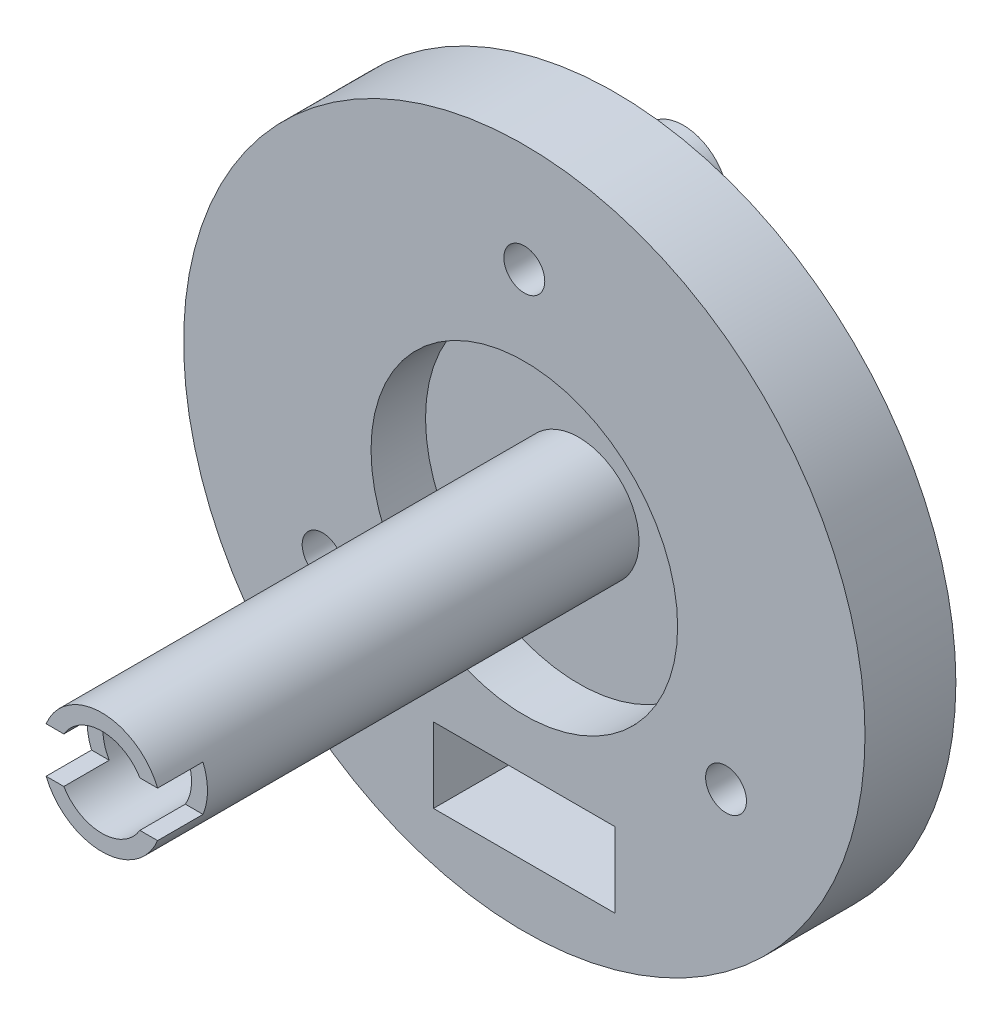
ISO-10303-21;
HEADER;
FILE_DESCRIPTION(('STEP AP214'),'2;1');
FILE_NAME('part.step','',(''),(''),'','','');
FILE_SCHEMA(('AUTOMOTIVE_DESIGN { 1 0 10303 214 1 1 1 1 }'));
ENDSEC;
DATA;
#1=APPLICATION_CONTEXT('core data for automotive mechanical design processes');
#2=APPLICATION_PROTOCOL_DEFINITION('international standard','automotive_design',2000,#1);
#3=PRODUCT_CONTEXT('',#1,'mechanical');
#4=PRODUCT('Part','Part','',(#3));
#5=PRODUCT_RELATED_PRODUCT_CATEGORY('part','',(#4));
#6=PRODUCT_DEFINITION_FORMATION('','',#4);
#7=PRODUCT_DEFINITION_CONTEXT('part definition',#1,'design');
#8=PRODUCT_DEFINITION('design','',#6,#7);
#9=PRODUCT_DEFINITION_SHAPE('','',#8);
#10=(LENGTH_UNIT() NAMED_UNIT(*) SI_UNIT(.MILLI.,.METRE.));
#11=(NAMED_UNIT(*) PLANE_ANGLE_UNIT() SI_UNIT($,.RADIAN.));
#12=(NAMED_UNIT(*) SI_UNIT($,.STERADIAN.) SOLID_ANGLE_UNIT());
#13=UNCERTAINTY_MEASURE_WITH_UNIT(LENGTH_MEASURE(1.E-05),#10,'distance_accuracy_value','');
#14=(GEOMETRIC_REPRESENTATION_CONTEXT(3) GLOBAL_UNCERTAINTY_ASSIGNED_CONTEXT((#13)) GLOBAL_UNIT_ASSIGNED_CONTEXT((#10,
#11,#12)) REPRESENTATION_CONTEXT('',''));
#15=CARTESIAN_POINT('',(0.,0.,0.));
#16=DIRECTION('',(0.,0.,1.));
#17=DIRECTION('',(1.,0.,0.));
#18=AXIS2_PLACEMENT_3D('',#15,#16,#17);
#19=CARTESIAN_POINT('',(175.5,-111.,25.6));
#20=DIRECTION('',(0.,0.,1.));
#21=DIRECTION('',(1.,0.,0.));
#22=AXIS2_PLACEMENT_3D('',#19,#20,#21);
#23=PLANE('',#22);
#24=DIRECTION('',(1.,0.,0.));
#25=VECTOR('',#24,1.);
#26=CARTESIAN_POINT('',(172.,-112.,25.6));
#27=LINE('',#26,#25);
#28=CARTESIAN_POINT('',(173.045921761638,-112.,25.6));
#29=VERTEX_POINT('',#28);
#30=CARTESIAN_POINT('',(173.825933095722,-112.,25.6));
#31=VERTEX_POINT('',#30);
#32=EDGE_CURVE('E314',#29,#31,#27,.T.);
#33=ORIENTED_EDGE('',*,*,#32,.F.);
#34=CARTESIAN_POINT('',(175.5,-111.,25.6));
#35=DIRECTION('',(0.,0.,1.));
#36=DIRECTION('',(1.,0.,0.));
#37=AXIS2_PLACEMENT_3D('',#34,#35,#36);
#38=CIRCLE('',#37,2.65000000000001);
#39=CARTESIAN_POINT('',(177.954078238362,-112.,25.6));
#40=VERTEX_POINT('',#39);
#41=EDGE_CURVE('E177',#29,#40,#38,.T.);
#42=ORIENTED_EDGE('',*,*,#41,.T.);
#43=CARTESIAN_POINT('',(177.174066904278,-112.,25.6));
#44=VERTEX_POINT('',#43);
#45=EDGE_CURVE('E168',#44,#40,#27,.T.);
#46=ORIENTED_EDGE('',*,*,#45,.F.);
#47=CARTESIAN_POINT('',(175.5,-111.,25.6));
#48=DIRECTION('',(0.,0.,1.));
#49=DIRECTION('',(1.,0.,0.));
#50=AXIS2_PLACEMENT_3D('',#47,#48,#49);
#51=CIRCLE('',#50,1.95);
#52=EDGE_CURVE('E295',#31,#44,#51,.T.);
#53=ORIENTED_EDGE('',*,*,#52,.F.);
#54=EDGE_LOOP('',(#33,#42,#46,#53));
#55=FACE_BOUND('',#54,.T.);
#56=ADVANCED_FACE('F34',(#55),#23,.T.);
#57=CARTESIAN_POINT('',(175.5,-111.,4.6));
#58=DIRECTION('',(0.,0.,1.));
#59=DIRECTION('',(1.,0.,0.));
#60=AXIS2_PLACEMENT_3D('',#57,#58,#59);
#61=PLANE('',#60);
#62=CARTESIAN_POINT('',(175.5,-111.,4.6));
#63=DIRECTION('',(0.,0.,1.));
#64=DIRECTION('',(1.,0.,0.));
#65=AXIS2_PLACEMENT_3D('',#62,#63,#64);
#66=CIRCLE('',#65,6.75);
#67=CARTESIAN_POINT('',(182.25,-111.,4.6));
#68=VERTEX_POINT('',#67);
#69=EDGE_CURVE('E208',#68,#68,#66,.T.);
#70=ORIENTED_EDGE('',*,*,#69,.T.);
#71=EDGE_LOOP('',(#70));
#72=FACE_BOUND('',#71,.T.);
#73=CARTESIAN_POINT('',(175.5,-111.,4.6));
#74=DIRECTION('',(0.,0.,1.));
#75=DIRECTION('',(1.,0.,0.));
#76=AXIS2_PLACEMENT_3D('',#73,#74,#75);
#77=CIRCLE('',#76,2.65000000000001);
#78=CARTESIAN_POINT('',(178.15,-111.,4.6));
#79=VERTEX_POINT('',#78);
#80=EDGE_CURVE('E182',#79,#79,#77,.T.);
#81=ORIENTED_EDGE('',*,*,#80,.F.);
#82=EDGE_LOOP('',(#81));
#83=FACE_BOUND('',#82,.T.);
#84=ADVANCED_FACE('F346',(#72,#83),#61,.T.);
#85=CARTESIAN_POINT('',(175.5,-111.,7.));
#86=DIRECTION('',(0.,0.,-1.));
#87=DIRECTION('',(-1.,0.,0.));
#88=AXIS2_PLACEMENT_3D('',#85,#86,#87);
#89=CYLINDRICAL_SURFACE('',#88,1.95);
#90=DIRECTION('',(0.,0.,-1.));
#91=VECTOR('',#90,1.);
#92=CARTESIAN_POINT('',(173.825933095722,-112.,7.));
#93=LINE('',#92,#91);
#94=CARTESIAN_POINT('',(173.825933095722,-112.,23.6));
#95=VERTEX_POINT('',#94);
#96=EDGE_CURVE('E289',#31,#95,#93,.T.);
#97=ORIENTED_EDGE('',*,*,#96,.F.);
#98=ORIENTED_EDGE('',*,*,#52,.T.);
#99=DIRECTION('',(0.,0.,-1.));
#100=VECTOR('',#99,1.);
#101=CARTESIAN_POINT('',(177.174066904278,-112.,7.));
#102=LINE('',#101,#100);
#103=CARTESIAN_POINT('',(177.174066904278,-112.,23.6));
#104=VERTEX_POINT('',#103);
#105=EDGE_CURVE('E325',#104,#44,#102,.F.);
#106=ORIENTED_EDGE('',*,*,#105,.F.);
#107=CARTESIAN_POINT('',(175.5,-111.,23.6));
#108=DIRECTION('',(0.,0.,1.));
#109=DIRECTION('',(1.,0.,0.));
#110=AXIS2_PLACEMENT_3D('',#107,#108,#109);
#111=CIRCLE('',#110,1.95);
#112=CARTESIAN_POINT('',(177.174066904278,-110.,23.6));
#113=VERTEX_POINT('',#112);
#114=EDGE_CURVE('E308',#104,#113,#111,.T.);
#115=ORIENTED_EDGE('',*,*,#114,.T.);
#116=DIRECTION('',(0.,0.,-1.));
#117=VECTOR('',#116,1.);
#118=CARTESIAN_POINT('',(177.174066904278,-110.,7.));
#119=LINE('',#118,#117);
#120=CARTESIAN_POINT('',(177.174066904278,-110.,25.6));
#121=VERTEX_POINT('',#120);
#122=EDGE_CURVE('E323',#121,#113,#119,.T.);
#123=ORIENTED_EDGE('',*,*,#122,.F.);
#124=CARTESIAN_POINT('',(173.825933095722,-110.,25.6));
#125=VERTEX_POINT('',#124);
#126=EDGE_CURVE('E167',#121,#125,#51,.T.);
#127=ORIENTED_EDGE('',*,*,#126,.T.);
#128=DIRECTION('',(0.,0.,-1.));
#129=VECTOR('',#128,1.);
#130=CARTESIAN_POINT('',(173.825933095722,-110.,7.));
#131=LINE('',#130,#129);
#132=CARTESIAN_POINT('',(173.825933095722,-110.,23.6));
#133=VERTEX_POINT('',#132);
#134=EDGE_CURVE('E321',#133,#125,#131,.F.);
#135=ORIENTED_EDGE('',*,*,#134,.F.);
#136=EDGE_CURVE('E320',#133,#95,#111,.T.);
#137=ORIENTED_EDGE('',*,*,#136,.T.);
#138=EDGE_LOOP('',(#97,#98,#106,#115,#123,#127,#135,#137));
#139=FACE_BOUND('',#138,.T.);
#140=CARTESIAN_POINT('',(175.5,-111.,4.));
#141=DIRECTION('',(0.,0.,-1.));
#142=DIRECTION('',(-1.,0.,0.));
#143=AXIS2_PLACEMENT_3D('',#140,#141,#142);
#144=CIRCLE('',#143,1.95);
#145=CARTESIAN_POINT('',(177.45,-111.,4.));
#146=VERTEX_POINT('',#145);
#147=CARTESIAN_POINT('',(173.55,-111.,4.));
#148=VERTEX_POINT('',#147);
#149=EDGE_CURVE('E198',#146,#148,#144,.T.);
#150=ORIENTED_EDGE('',*,*,#149,.T.);
#151=DIRECTION('',(0.,0.,-1.));
#152=VECTOR('',#151,1.);
#153=CARTESIAN_POINT('',(173.55,-111.,4.));
#154=LINE('',#153,#152);
#155=CARTESIAN_POINT('',(173.55,-111.,3.));
#156=VERTEX_POINT('',#155);
#157=EDGE_CURVE('E195',#148,#156,#154,.T.);
#158=ORIENTED_EDGE('',*,*,#157,.T.);
#159=CARTESIAN_POINT('',(175.5,-111.,3.));
#160=DIRECTION('',(0.,0.,1.));
#161=DIRECTION('',(1.,0.,0.));
#162=AXIS2_PLACEMENT_3D('',#159,#160,#161);
#163=CIRCLE('',#162,1.95);
#164=CARTESIAN_POINT('',(177.45,-111.,3.));
#165=VERTEX_POINT('',#164);
#166=EDGE_CURVE('E259',#165,#156,#163,.T.);
#167=ORIENTED_EDGE('',*,*,#166,.F.);
#168=DIRECTION('',(0.,0.,-1.));
#169=VECTOR('',#168,1.);
#170=CARTESIAN_POINT('',(177.45,-111.,4.));
#171=LINE('',#170,#169);
#172=EDGE_CURVE('E192',#146,#165,#171,.T.);
#173=ORIENTED_EDGE('',*,*,#172,.F.);
#174=EDGE_LOOP('',(#150,#158,#167,#173));
#175=FACE_BOUND('',#174,.T.);
#176=ADVANCED_FACE('F330',(#139,#175),#89,.F.);
#177=CARTESIAN_POINT('',(175.5,-111.,7.));
#178=DIRECTION('',(0.,0.,1.));
#179=DIRECTION('',(1.,0.,0.));
#180=AXIS2_PLACEMENT_3D('',#177,#178,#179);
#181=PLANE('',#180);
#182=CARTESIAN_POINT('',(175.5,-100.75,7.));
#183=DIRECTION('',(0.,0.,1.));
#184=DIRECTION('',(1.,0.,0.));
#185=AXIS2_PLACEMENT_3D('',#182,#183,#184);
#186=CIRCLE('',#185,0.900000000000003);
#187=CARTESIAN_POINT('',(176.4,-100.75,7.));
#188=VERTEX_POINT('',#187);
#189=EDGE_CURVE('E292',#188,#188,#186,.T.);
#190=ORIENTED_EDGE('',*,*,#189,.F.);
#191=EDGE_LOOP('',(#190));
#192=FACE_BOUND('',#191,.T.);
#193=CARTESIAN_POINT('',(184.38,-116.13,7.));
#194=DIRECTION('',(0.,0.,1.));
#195=DIRECTION('',(1.,0.,0.));
#196=AXIS2_PLACEMENT_3D('',#193,#194,#195);
#197=CIRCLE('',#196,0.900000000000034);
#198=CARTESIAN_POINT('',(185.28,-116.13,7.));
#199=VERTEX_POINT('',#198);
#200=EDGE_CURVE('E288',#199,#199,#197,.T.);
#201=ORIENTED_EDGE('',*,*,#200,.F.);
#202=EDGE_LOOP('',(#201));
#203=FACE_BOUND('',#202,.T.);
#204=CARTESIAN_POINT('',(166.62,-116.13,7.));
#205=DIRECTION('',(0.,0.,1.));
#206=DIRECTION('',(1.,0.,0.));
#207=AXIS2_PLACEMENT_3D('',#204,#205,#206);
#208=CIRCLE('',#207,0.900000000000034);
#209=CARTESIAN_POINT('',(167.52,-116.13,7.));
#210=VERTEX_POINT('',#209);
#211=EDGE_CURVE('E285',#210,#210,#208,.T.);
#212=ORIENTED_EDGE('',*,*,#211,.F.);
#213=EDGE_LOOP('',(#212));
#214=FACE_BOUND('',#213,.T.);
#215=CARTESIAN_POINT('',(175.5,-111.,7.));
#216=DIRECTION('',(0.,0.,1.));
#217=DIRECTION('',(1.,0.,0.));
#218=AXIS2_PLACEMENT_3D('',#215,#216,#217);
#219=CIRCLE('',#218,6.75);
#220=CARTESIAN_POINT('',(182.25,-111.,7.));
#221=VERTEX_POINT('',#220);
#222=EDGE_CURVE('E207',#221,#221,#219,.T.);
#223=ORIENTED_EDGE('',*,*,#222,.F.);
#224=EDGE_LOOP('',(#223));
#225=FACE_BOUND('',#224,.T.);
#226=CARTESIAN_POINT('',(175.5,-111.,7.));
#227=DIRECTION('',(0.,0.,1.));
#228=DIRECTION('',(1.,0.,0.));
#229=AXIS2_PLACEMENT_3D('',#226,#227,#228);
#230=CIRCLE('',#229,15.);
#231=CARTESIAN_POINT('',(190.5,-111.,7.));
#232=VERTEX_POINT('',#231);
#233=EDGE_CURVE('E263',#232,#232,#230,.T.);
#234=ORIENTED_EDGE('',*,*,#233,.T.);
#235=EDGE_LOOP('',(#234));
#236=FACE_BOUND('',#235,.T.);
#237=DIRECTION('',(1.,0.,0.));
#238=VECTOR('',#237,1.);
#239=CARTESIAN_POINT('',(171.5,-123.3,7.));
#240=LINE('',#239,#238);
#241=CARTESIAN_POINT('',(171.5,-123.3,7.));
#242=VERTEX_POINT('',#241);
#243=CARTESIAN_POINT('',(179.5,-123.3,7.));
#244=VERTEX_POINT('',#243);
#245=EDGE_CURVE('E216',#242,#244,#240,.T.);
#246=ORIENTED_EDGE('',*,*,#245,.F.);
#247=DIRECTION('',(0.,-1.,0.));
#248=VECTOR('',#247,1.);
#249=CARTESIAN_POINT('',(171.5,-120.,7.));
#250=LINE('',#249,#248);
#251=CARTESIAN_POINT('',(171.5,-120.,7.));
#252=VERTEX_POINT('',#251);
#253=EDGE_CURVE('E214',#252,#242,#250,.T.);
#254=ORIENTED_EDGE('',*,*,#253,.F.);
#255=DIRECTION('',(1.,0.,0.));
#256=VECTOR('',#255,1.);
#257=CARTESIAN_POINT('',(171.5,-120.,7.));
#258=LINE('',#257,#256);
#259=CARTESIAN_POINT('',(179.5,-120.,7.));
#260=VERTEX_POINT('',#259);
#261=EDGE_CURVE('E222',#252,#260,#258,.T.);
#262=ORIENTED_EDGE('',*,*,#261,.T.);
#263=DIRECTION('',(0.,-1.,0.));
#264=VECTOR('',#263,1.);
#265=CARTESIAN_POINT('',(179.5,-120.,7.));
#266=LINE('',#265,#264);
#267=EDGE_CURVE('E219',#260,#244,#266,.T.);
#268=ORIENTED_EDGE('',*,*,#267,.T.);
#269=EDGE_LOOP('',(#246,#254,#262,#268));
#270=FACE_BOUND('',#269,.T.);
#271=ADVANCED_FACE('F416',(#192,#203,#214,#225,#236,#270),#181,.T.);
#272=CARTESIAN_POINT('',(175.5,-111.,3.));
#273=DIRECTION('',(0.,0.,1.));
#274=DIRECTION('',(1.,0.,0.));
#275=AXIS2_PLACEMENT_3D('',#272,#273,#274);
#276=PLANE('',#275);
#277=CARTESIAN_POINT('',(175.5,-111.,3.));
#278=DIRECTION('',(0.,0.,1.));
#279=DIRECTION('',(1.,0.,0.));
#280=AXIS2_PLACEMENT_3D('',#277,#278,#279);
#281=CIRCLE('',#280,15.);
#282=CARTESIAN_POINT('',(190.5,-111.,3.));
#283=VERTEX_POINT('',#282);
#284=EDGE_CURVE('E262',#283,#283,#281,.T.);
#285=ORIENTED_EDGE('',*,*,#284,.F.);
#286=EDGE_LOOP('',(#285));
#287=FACE_BOUND('',#286,.T.);
#288=CARTESIAN_POINT('',(166.62,-116.13,3.));
#289=DIRECTION('',(0.,0.,1.));
#290=DIRECTION('',(1.,0.,0.));
#291=AXIS2_PLACEMENT_3D('',#288,#289,#290);
#292=CIRCLE('',#291,2.);
#293=CARTESIAN_POINT('',(168.62,-116.13,3.));
#294=VERTEX_POINT('',#293);
#295=EDGE_CURVE('E272',#294,#294,#292,.T.);
#296=ORIENTED_EDGE('',*,*,#295,.T.);
#297=EDGE_LOOP('',(#296));
#298=FACE_BOUND('',#297,.T.);
#299=CARTESIAN_POINT('',(175.5,-100.75,3.));
#300=DIRECTION('',(0.,0.,1.));
#301=DIRECTION('',(1.,0.,0.));
#302=AXIS2_PLACEMENT_3D('',#299,#300,#301);
#303=CIRCLE('',#302,2.);
#304=CARTESIAN_POINT('',(177.5,-100.75,3.));
#305=VERTEX_POINT('',#304);
#306=EDGE_CURVE('E275',#305,#305,#303,.F.);
#307=ORIENTED_EDGE('',*,*,#306,.F.);
#308=EDGE_LOOP('',(#307));
#309=FACE_BOUND('',#308,.T.);
#310=CARTESIAN_POINT('',(184.38,-116.13,3.));
#311=DIRECTION('',(0.,0.,1.));
#312=DIRECTION('',(1.,0.,0.));
#313=AXIS2_PLACEMENT_3D('',#310,#311,#312);
#314=CIRCLE('',#313,2.);
#315=CARTESIAN_POINT('',(186.38,-116.13,3.));
#316=VERTEX_POINT('',#315);
#317=EDGE_CURVE('E280',#316,#316,#314,.F.);
#318=ORIENTED_EDGE('',*,*,#317,.F.);
#319=EDGE_LOOP('',(#318));
#320=FACE_BOUND('',#319,.T.);
#321=ORIENTED_EDGE('',*,*,#166,.T.);
#322=DIRECTION('',(0.,1.,0.));
#323=VECTOR('',#322,1.);
#324=CARTESIAN_POINT('',(173.55,-111.,3.));
#325=LINE('',#324,#323);
#326=CARTESIAN_POINT('',(173.55,-120.,3.));
#327=VERTEX_POINT('',#326);
#328=EDGE_CURVE('E179',#327,#156,#325,.T.);
#329=ORIENTED_EDGE('',*,*,#328,.F.);
#330=DIRECTION('',(1.,0.,0.));
#331=VECTOR('',#330,1.);
#332=CARTESIAN_POINT('',(171.5,-120.,3.));
#333=LINE('',#332,#331);
#334=CARTESIAN_POINT('',(171.5,-120.,3.));
#335=VERTEX_POINT('',#334);
#336=EDGE_CURVE('E217',#335,#327,#333,.T.);
#337=ORIENTED_EDGE('',*,*,#336,.F.);
#338=DIRECTION('',(0.,-1.,0.));
#339=VECTOR('',#338,1.);
#340=CARTESIAN_POINT('',(171.5,-120.,3.));
#341=LINE('',#340,#339);
#342=CARTESIAN_POINT('',(171.5,-123.3,3.));
#343=VERTEX_POINT('',#342);
#344=EDGE_CURVE('E211',#335,#343,#341,.T.);
#345=ORIENTED_EDGE('',*,*,#344,.T.);
#346=DIRECTION('',(1.,0.,0.));
#347=VECTOR('',#346,1.);
#348=CARTESIAN_POINT('',(171.5,-123.3,3.));
#349=LINE('',#348,#347);
#350=CARTESIAN_POINT('',(179.5,-123.3,3.));
#351=VERTEX_POINT('',#350);
#352=EDGE_CURVE('E228',#343,#351,#349,.T.);
#353=ORIENTED_EDGE('',*,*,#352,.T.);
#354=DIRECTION('',(0.,-1.,0.));
#355=VECTOR('',#354,1.);
#356=CARTESIAN_POINT('',(179.5,-120.,3.));
#357=LINE('',#356,#355);
#358=CARTESIAN_POINT('',(179.5,-120.,3.));
#359=VERTEX_POINT('',#358);
#360=EDGE_CURVE('E231',#359,#351,#357,.T.);
#361=ORIENTED_EDGE('',*,*,#360,.F.);
#362=CARTESIAN_POINT('',(177.45,-120.,3.));
#363=VERTEX_POINT('',#362);
#364=EDGE_CURVE('E234',#363,#359,#333,.T.);
#365=ORIENTED_EDGE('',*,*,#364,.F.);
#366=DIRECTION('',(0.,-1.,0.));
#367=VECTOR('',#366,1.);
#368=CARTESIAN_POINT('',(177.45,-111.,3.));
#369=LINE('',#368,#367);
#370=EDGE_CURVE('E176',#165,#363,#369,.T.);
#371=ORIENTED_EDGE('',*,*,#370,.F.);
#372=EDGE_LOOP('',(#321,#329,#337,#345,#353,#361,#365,#371));
#373=FACE_BOUND('',#372,.T.);
#374=ADVANCED_FACE('F419',(#287,#298,#309,#320,#373),#276,.F.);
#375=CARTESIAN_POINT('',(166.62,-116.13,0.));
#376=DIRECTION('',(0.,0.,1.));
#377=DIRECTION('',(1.,0.,0.));
#378=AXIS2_PLACEMENT_3D('',#375,#376,#377);
#379=PLANE('',#378);
#380=CARTESIAN_POINT('',(166.62,-116.13,0.));
#381=DIRECTION('',(0.,0.,1.));
#382=DIRECTION('',(1.,0.,0.));
#383=AXIS2_PLACEMENT_3D('',#380,#381,#382);
#384=CIRCLE('',#383,2.);
#385=CARTESIAN_POINT('',(168.62,-116.13,0.));
#386=VERTEX_POINT('',#385);
#387=EDGE_CURVE('E271',#386,#386,#384,.T.);
#388=ORIENTED_EDGE('',*,*,#387,.F.);
#389=EDGE_LOOP('',(#388));
#390=FACE_BOUND('',#389,.T.);
#391=CARTESIAN_POINT('',(166.62,-116.13,0.));
#392=DIRECTION('',(0.,0.,1.));
#393=DIRECTION('',(1.,0.,0.));
#394=AXIS2_PLACEMENT_3D('',#391,#392,#393);
#395=CIRCLE('',#394,0.900000000000003);
#396=CARTESIAN_POINT('',(167.52,-116.13,0.));
#397=VERTEX_POINT('',#396);
#398=EDGE_CURVE('E266',#397,#397,#395,.T.);
#399=ORIENTED_EDGE('',*,*,#398,.T.);
#400=EDGE_LOOP('',(#399));
#401=FACE_BOUND('',#400,.T.);
#402=ADVANCED_FACE('F423',(#390,#401),#379,.F.);
#403=CARTESIAN_POINT('',(166.62,-116.13,3.));
#404=DIRECTION('',(0.,0.,-1.));
#405=DIRECTION('',(-1.,0.,0.));
#406=AXIS2_PLACEMENT_3D('',#403,#404,#405);
#407=CYLINDRICAL_SURFACE('',#406,2.);
#408=ORIENTED_EDGE('',*,*,#295,.F.);
#409=EDGE_LOOP('',(#408));
#410=FACE_BOUND('',#409,.T.);
#411=ORIENTED_EDGE('',*,*,#387,.T.);
#412=EDGE_LOOP('',(#411));
#413=FACE_BOUND('',#412,.T.);
#414=ADVANCED_FACE('F36',(#410,#413),#407,.T.);
#415=CARTESIAN_POINT('',(166.62,-116.13,3.));
#416=DIRECTION('',(0.,0.,-1.));
#417=DIRECTION('',(-1.,0.,0.));
#418=AXIS2_PLACEMENT_3D('',#415,#416,#417);
#419=CYLINDRICAL_SURFACE('',#418,0.900000000000003);
#420=ORIENTED_EDGE('',*,*,#398,.F.);
#421=EDGE_LOOP('',(#420));
#422=FACE_BOUND('',#421,.T.);
#423=ORIENTED_EDGE('',*,*,#211,.T.);
#424=EDGE_LOOP('',(#423));
#425=FACE_BOUND('',#424,.T.);
#426=ADVANCED_FACE('F427',(#422,#425),#419,.F.);
#427=CARTESIAN_POINT('',(175.5,-111.,7.));
#428=DIRECTION('',(0.,0.,-1.));
#429=DIRECTION('',(-1.,0.,0.));
#430=AXIS2_PLACEMENT_3D('',#427,#428,#429);
#431=CYLINDRICAL_SURFACE('',#430,15.);
#432=ORIENTED_EDGE('',*,*,#233,.F.);
#433=EDGE_LOOP('',(#432));
#434=FACE_BOUND('',#433,.T.);
#435=ORIENTED_EDGE('',*,*,#284,.T.);
#436=EDGE_LOOP('',(#435));
#437=FACE_BOUND('',#436,.T.);
#438=ADVANCED_FACE('F409',(#434,#437),#431,.T.);
#439=CARTESIAN_POINT('',(175.5,-100.75,0.));
#440=DIRECTION('',(0.,0.,1.));
#441=DIRECTION('',(1.,0.,0.));
#442=AXIS2_PLACEMENT_3D('',#439,#440,#441);
#443=PLANE('',#442);
#444=CARTESIAN_POINT('',(175.5,-100.75,0.));
#445=DIRECTION('',(0.,0.,1.));
#446=DIRECTION('',(1.,0.,0.));
#447=AXIS2_PLACEMENT_3D('',#444,#445,#446);
#448=CIRCLE('',#447,2.);
#449=CARTESIAN_POINT('',(177.5,-100.75,0.));
#450=VERTEX_POINT('',#449);
#451=EDGE_CURVE('E256',#450,#450,#448,.T.);
#452=ORIENTED_EDGE('',*,*,#451,.F.);
#453=EDGE_LOOP('',(#452));
#454=FACE_BOUND('',#453,.T.);
#455=CARTESIAN_POINT('',(175.5,-100.75,0.));
#456=DIRECTION('',(0.,0.,1.));
#457=DIRECTION('',(1.,0.,0.));
#458=AXIS2_PLACEMENT_3D('',#455,#456,#457);
#459=CIRCLE('',#458,0.900000000000003);
#460=CARTESIAN_POINT('',(176.4,-100.75,0.));
#461=VERTEX_POINT('',#460);
#462=EDGE_CURVE('E253',#461,#461,#459,.T.);
#463=ORIENTED_EDGE('',*,*,#462,.T.);
#464=EDGE_LOOP('',(#463));
#465=FACE_BOUND('',#464,.T.);
#466=ADVANCED_FACE('F406',(#454,#465),#443,.F.);
#467=CARTESIAN_POINT('',(175.5,-100.75,3.));
#468=DIRECTION('',(0.,0.,-1.));
#469=DIRECTION('',(-1.,0.,0.));
#470=AXIS2_PLACEMENT_3D('',#467,#468,#469);
#471=CYLINDRICAL_SURFACE('',#470,2.);
#472=ORIENTED_EDGE('',*,*,#306,.T.);
#473=EDGE_LOOP('',(#472));
#474=FACE_BOUND('',#473,.T.);
#475=ORIENTED_EDGE('',*,*,#451,.T.);
#476=EDGE_LOOP('',(#475));
#477=FACE_BOUND('',#476,.T.);
#478=ADVANCED_FACE('F404',(#474,#477),#471,.T.);
#479=CARTESIAN_POINT('',(175.5,-100.75,3.));
#480=DIRECTION('',(0.,0.,-1.));
#481=DIRECTION('',(-1.,0.,0.));
#482=AXIS2_PLACEMENT_3D('',#479,#480,#481);
#483=CYLINDRICAL_SURFACE('',#482,0.900000000000003);
#484=ORIENTED_EDGE('',*,*,#462,.F.);
#485=EDGE_LOOP('',(#484));
#486=FACE_BOUND('',#485,.T.);
#487=ORIENTED_EDGE('',*,*,#189,.T.);
#488=EDGE_LOOP('',(#487));
#489=FACE_BOUND('',#488,.T.);
#490=ADVANCED_FACE('F397',(#486,#489),#483,.F.);
#491=CARTESIAN_POINT('',(184.38,-116.13,0.));
#492=DIRECTION('',(0.,0.,1.));
#493=DIRECTION('',(1.,0.,0.));
#494=AXIS2_PLACEMENT_3D('',#491,#492,#493);
#495=PLANE('',#494);
#496=CARTESIAN_POINT('',(184.38,-116.13,0.));
#497=DIRECTION('',(0.,0.,1.));
#498=DIRECTION('',(1.,0.,0.));
#499=AXIS2_PLACEMENT_3D('',#496,#497,#498);
#500=CIRCLE('',#499,2.);
#501=CARTESIAN_POINT('',(186.38,-116.13,0.));
#502=VERTEX_POINT('',#501);
#503=EDGE_CURVE('E250',#502,#502,#500,.T.);
#504=ORIENTED_EDGE('',*,*,#503,.F.);
#505=EDGE_LOOP('',(#504));
#506=FACE_BOUND('',#505,.T.);
#507=CARTESIAN_POINT('',(184.38,-116.13,0.));
#508=DIRECTION('',(0.,0.,1.));
#509=DIRECTION('',(1.,0.,0.));
#510=AXIS2_PLACEMENT_3D('',#507,#508,#509);
#511=CIRCLE('',#510,0.900000000000034);
#512=CARTESIAN_POINT('',(185.28,-116.13,0.));
#513=VERTEX_POINT('',#512);
#514=EDGE_CURVE('E247',#513,#513,#511,.T.);
#515=ORIENTED_EDGE('',*,*,#514,.T.);
#516=EDGE_LOOP('',(#515));
#517=FACE_BOUND('',#516,.T.);
#518=ADVANCED_FACE('F394',(#506,#517),#495,.F.);
#519=CARTESIAN_POINT('',(184.38,-116.13,3.));
#520=DIRECTION('',(0.,0.,-1.));
#521=DIRECTION('',(-1.,0.,0.));
#522=AXIS2_PLACEMENT_3D('',#519,#520,#521);
#523=CYLINDRICAL_SURFACE('',#522,2.);
#524=ORIENTED_EDGE('',*,*,#317,.T.);
#525=EDGE_LOOP('',(#524));
#526=FACE_BOUND('',#525,.T.);
#527=ORIENTED_EDGE('',*,*,#503,.T.);
#528=EDGE_LOOP('',(#527));
#529=FACE_BOUND('',#528,.T.);
#530=ADVANCED_FACE('F392',(#526,#529),#523,.T.);
#531=CARTESIAN_POINT('',(184.38,-116.13,3.));
#532=DIRECTION('',(0.,0.,-1.));
#533=DIRECTION('',(-1.,0.,0.));
#534=AXIS2_PLACEMENT_3D('',#531,#532,#533);
#535=CYLINDRICAL_SURFACE('',#534,0.900000000000034);
#536=ORIENTED_EDGE('',*,*,#514,.F.);
#537=EDGE_LOOP('',(#536));
#538=FACE_BOUND('',#537,.T.);
#539=ORIENTED_EDGE('',*,*,#200,.T.);
#540=EDGE_LOOP('',(#539));
#541=FACE_BOUND('',#540,.T.);
#542=ADVANCED_FACE('F388',(#538,#541),#535,.F.);
#543=CARTESIAN_POINT('',(171.5,-120.,7.));
#544=DIRECTION('',(1.,0.,0.));
#545=DIRECTION('',(0.,0.,-1.));
#546=AXIS2_PLACEMENT_3D('',#543,#544,#545);
#547=PLANE('',#546);
#548=ORIENTED_EDGE('',*,*,#344,.F.);
#549=DIRECTION('',(0.,0.,-1.));
#550=VECTOR('',#549,1.);
#551=CARTESIAN_POINT('',(171.5,-120.,7.));
#552=LINE('',#551,#550);
#553=EDGE_CURVE('E225',#252,#335,#552,.T.);
#554=ORIENTED_EDGE('',*,*,#553,.F.);
#555=ORIENTED_EDGE('',*,*,#253,.T.);
#556=DIRECTION('',(0.,0.,-1.));
#557=VECTOR('',#556,1.);
#558=CARTESIAN_POINT('',(171.5,-123.3,7.));
#559=LINE('',#558,#557);
#560=EDGE_CURVE('E244',#242,#343,#559,.T.);
#561=ORIENTED_EDGE('',*,*,#560,.T.);
#562=EDGE_LOOP('',(#548,#554,#555,#561));
#563=FACE_BOUND('',#562,.T.);
#564=ADVANCED_FACE('F384',(#563),#547,.T.);
#565=CARTESIAN_POINT('',(171.5,-123.3,7.));
#566=DIRECTION('',(0.,1.,0.));
#567=DIRECTION('',(0.,0.,1.));
#568=AXIS2_PLACEMENT_3D('',#565,#566,#567);
#569=PLANE('',#568);
#570=ORIENTED_EDGE('',*,*,#352,.F.);
#571=ORIENTED_EDGE('',*,*,#560,.F.);
#572=ORIENTED_EDGE('',*,*,#245,.T.);
#573=DIRECTION('',(0.,0.,-1.));
#574=VECTOR('',#573,1.);
#575=CARTESIAN_POINT('',(179.5,-123.3,7.));
#576=LINE('',#575,#574);
#577=EDGE_CURVE('E242',#244,#351,#576,.T.);
#578=ORIENTED_EDGE('',*,*,#577,.T.);
#579=EDGE_LOOP('',(#570,#571,#572,#578));
#580=FACE_BOUND('',#579,.T.);
#581=ADVANCED_FACE('F380',(#580),#569,.T.);
#582=CARTESIAN_POINT('',(179.5,-120.,7.));
#583=DIRECTION('',(1.,0.,0.));
#584=DIRECTION('',(0.,0.,-1.));
#585=AXIS2_PLACEMENT_3D('',#582,#583,#584);
#586=PLANE('',#585);
#587=ORIENTED_EDGE('',*,*,#360,.T.);
#588=ORIENTED_EDGE('',*,*,#577,.F.);
#589=ORIENTED_EDGE('',*,*,#267,.F.);
#590=DIRECTION('',(0.,0.,-1.));
#591=VECTOR('',#590,1.);
#592=CARTESIAN_POINT('',(179.5,-120.,7.));
#593=LINE('',#592,#591);
#594=EDGE_CURVE('E239',#260,#359,#593,.T.);
#595=ORIENTED_EDGE('',*,*,#594,.T.);
#596=EDGE_LOOP('',(#587,#588,#589,#595));
#597=FACE_BOUND('',#596,.T.);
#598=ADVANCED_FACE('F376',(#597),#586,.F.);
#599=CARTESIAN_POINT('',(171.5,-120.,7.));
#600=DIRECTION('',(0.,1.,0.));
#601=DIRECTION('',(0.,0.,1.));
#602=AXIS2_PLACEMENT_3D('',#599,#600,#601);
#603=PLANE('',#602);
#604=ORIENTED_EDGE('',*,*,#336,.T.);
#605=DIRECTION('',(0.,0.,-1.));
#606=VECTOR('',#605,1.);
#607=CARTESIAN_POINT('',(173.55,-120.,4.));
#608=LINE('',#607,#606);
#609=CARTESIAN_POINT('',(173.55,-120.,4.));
#610=VERTEX_POINT('',#609);
#611=EDGE_CURVE('E199',#610,#327,#608,.T.);
#612=ORIENTED_EDGE('',*,*,#611,.F.);
#613=DIRECTION('',(-1.,0.,0.));
#614=VECTOR('',#613,1.);
#615=CARTESIAN_POINT('',(171.5,-120.,4.));
#616=LINE('',#615,#614);
#617=CARTESIAN_POINT('',(177.45,-120.,4.));
#618=VERTEX_POINT('',#617);
#619=EDGE_CURVE('E283',#618,#610,#616,.T.);
#620=ORIENTED_EDGE('',*,*,#619,.F.);
#621=DIRECTION('',(0.,0.,-1.));
#622=VECTOR('',#621,1.);
#623=CARTESIAN_POINT('',(177.45,-120.,4.));
#624=LINE('',#623,#622);
#625=EDGE_CURVE('E201',#618,#363,#624,.T.);
#626=ORIENTED_EDGE('',*,*,#625,.T.);
#627=ORIENTED_EDGE('',*,*,#364,.T.);
#628=ORIENTED_EDGE('',*,*,#594,.F.);
#629=ORIENTED_EDGE('',*,*,#261,.F.);
#630=ORIENTED_EDGE('',*,*,#553,.T.);
#631=EDGE_LOOP('',(#604,#612,#620,#626,#627,#628,#629,#630));
#632=FACE_BOUND('',#631,.T.);
#633=ADVANCED_FACE('F372',(#632),#603,.F.);
#634=CARTESIAN_POINT('',(175.5,-111.,4.6));
#635=DIRECTION('',(0.,0.,1.));
#636=DIRECTION('',(1.,0.,0.));
#637=AXIS2_PLACEMENT_3D('',#634,#635,#636);
#638=CYLINDRICAL_SURFACE('',#637,6.75);
#639=ORIENTED_EDGE('',*,*,#69,.F.);
#640=EDGE_LOOP('',(#639));
#641=FACE_BOUND('',#640,.T.);
#642=ORIENTED_EDGE('',*,*,#222,.T.);
#643=EDGE_LOOP('',(#642));
#644=FACE_BOUND('',#643,.T.);
#645=ADVANCED_FACE('F369',(#641,#644),#638,.F.);
#646=CARTESIAN_POINT('',(175.5,-111.,4.));
#647=DIRECTION('',(0.,0.,-1.));
#648=DIRECTION('',(-1.,0.,0.));
#649=AXIS2_PLACEMENT_3D('',#646,#647,#648);
#650=PLANE('',#649);
#651=DIRECTION('',(0.,-1.,0.));
#652=VECTOR('',#651,1.);
#653=CARTESIAN_POINT('',(177.45,-111.,4.));
#654=LINE('',#653,#652);
#655=EDGE_CURVE('E188',#146,#618,#654,.T.);
#656=ORIENTED_EDGE('',*,*,#655,.T.);
#657=ORIENTED_EDGE('',*,*,#619,.T.);
#658=DIRECTION('',(0.,1.,0.));
#659=VECTOR('',#658,1.);
#660=CARTESIAN_POINT('',(173.55,-111.,4.));
#661=LINE('',#660,#659);
#662=EDGE_CURVE('E190',#610,#148,#661,.T.);
#663=ORIENTED_EDGE('',*,*,#662,.T.);
#664=ORIENTED_EDGE('',*,*,#149,.F.);
#665=EDGE_LOOP('',(#656,#657,#663,#664));
#666=FACE_BOUND('',#665,.T.);
#667=ADVANCED_FACE('F364',(#666),#650,.T.);
#668=CARTESIAN_POINT('',(173.55,-111.,4.));
#669=DIRECTION('',(-1.,0.,0.));
#670=DIRECTION('',(0.,0.,1.));
#671=AXIS2_PLACEMENT_3D('',#668,#669,#670);
#672=PLANE('',#671);
#673=ORIENTED_EDGE('',*,*,#328,.T.);
#674=ORIENTED_EDGE('',*,*,#157,.F.);
#675=ORIENTED_EDGE('',*,*,#662,.F.);
#676=ORIENTED_EDGE('',*,*,#611,.T.);
#677=EDGE_LOOP('',(#673,#674,#675,#676));
#678=FACE_BOUND('',#677,.T.);
#679=ADVANCED_FACE('F358',(#678),#672,.F.);
#680=CARTESIAN_POINT('',(177.45,-111.,4.));
#681=DIRECTION('',(1.,0.,0.));
#682=DIRECTION('',(0.,0.,-1.));
#683=AXIS2_PLACEMENT_3D('',#680,#681,#682);
#684=PLANE('',#683);
#685=ORIENTED_EDGE('',*,*,#370,.T.);
#686=ORIENTED_EDGE('',*,*,#625,.F.);
#687=ORIENTED_EDGE('',*,*,#655,.F.);
#688=ORIENTED_EDGE('',*,*,#172,.T.);
#689=EDGE_LOOP('',(#685,#686,#687,#688));
#690=FACE_BOUND('',#689,.T.);
#691=ADVANCED_FACE('F354',(#690),#684,.F.);
#692=DIRECTION('',(-1.,0.,0.));
#693=VECTOR('',#692,1.);
#694=CARTESIAN_POINT('',(172.,-110.,25.6));
#695=LINE('',#694,#693);
#696=CARTESIAN_POINT('',(177.954078238362,-110.,25.6));
#697=VERTEX_POINT('',#696);
#698=EDGE_CURVE('E150',#697,#121,#695,.T.);
#699=ORIENTED_EDGE('',*,*,#698,.F.);
#700=CARTESIAN_POINT('',(173.045921761638,-110.,25.6));
#701=VERTEX_POINT('',#700);
#702=EDGE_CURVE('E165',#697,#701,#38,.T.);
#703=ORIENTED_EDGE('',*,*,#702,.T.);
#704=EDGE_CURVE('E169',#125,#701,#695,.T.);
#705=ORIENTED_EDGE('',*,*,#704,.F.);
#706=ORIENTED_EDGE('',*,*,#126,.F.);
#707=EDGE_LOOP('',(#699,#703,#705,#706));
#708=FACE_BOUND('',#707,.T.);
#709=ADVANCED_FACE('F163',(#708),#23,.T.);
#710=CARTESIAN_POINT('',(175.5,-111.,25.6));
#711=DIRECTION('',(0.,0.,-1.));
#712=DIRECTION('',(-1.,0.,0.));
#713=AXIS2_PLACEMENT_3D('',#710,#711,#712);
#714=CYLINDRICAL_SURFACE('',#713,2.65000000000001);
#715=ORIENTED_EDGE('',*,*,#41,.F.);
#716=DIRECTION('',(0.,0.,-1.));
#717=VECTOR('',#716,1.);
#718=CARTESIAN_POINT('',(173.045921761638,-112.,25.6));
#719=LINE('',#718,#717);
#720=CARTESIAN_POINT('',(173.045921761638,-112.,23.6));
#721=VERTEX_POINT('',#720);
#722=EDGE_CURVE('E11',#29,#721,#719,.T.);
#723=ORIENTED_EDGE('',*,*,#722,.T.);
#724=CARTESIAN_POINT('',(175.5,-111.,23.6));
#725=DIRECTION('',(0.,0.,1.));
#726=DIRECTION('',(1.,0.,0.));
#727=AXIS2_PLACEMENT_3D('',#724,#725,#726);
#728=CIRCLE('',#727,2.65000000000001);
#729=CARTESIAN_POINT('',(173.045921761638,-110.,23.6));
#730=VERTEX_POINT('',#729);
#731=EDGE_CURVE('E296',#730,#721,#728,.T.);
#732=ORIENTED_EDGE('',*,*,#731,.F.);
#733=DIRECTION('',(0.,0.,-1.));
#734=VECTOR('',#733,1.);
#735=CARTESIAN_POINT('',(173.045921761638,-110.,25.6));
#736=LINE('',#735,#734);
#737=EDGE_CURVE('E42',#730,#701,#736,.F.);
#738=ORIENTED_EDGE('',*,*,#737,.T.);
#739=ORIENTED_EDGE('',*,*,#702,.F.);
#740=DIRECTION('',(0.,0.,-1.));
#741=VECTOR('',#740,1.);
#742=CARTESIAN_POINT('',(177.954078238362,-110.,25.6));
#743=LINE('',#742,#741);
#744=CARTESIAN_POINT('',(177.954078238362,-110.,23.6));
#745=VERTEX_POINT('',#744);
#746=EDGE_CURVE('E147',#697,#745,#743,.T.);
#747=ORIENTED_EDGE('',*,*,#746,.T.);
#748=CARTESIAN_POINT('',(177.954078238362,-112.,23.6));
#749=VERTEX_POINT('',#748);
#750=EDGE_CURVE('E158',#749,#745,#728,.T.);
#751=ORIENTED_EDGE('',*,*,#750,.F.);
#752=DIRECTION('',(0.,0.,-1.));
#753=VECTOR('',#752,1.);
#754=CARTESIAN_POINT('',(177.954078238362,-112.,25.6));
#755=LINE('',#754,#753);
#756=EDGE_CURVE('E157',#749,#40,#755,.F.);
#757=ORIENTED_EDGE('',*,*,#756,.T.);
#758=EDGE_LOOP('',(#715,#723,#732,#738,#739,#747,#751,#757));
#759=FACE_BOUND('',#758,.T.);
#760=ORIENTED_EDGE('',*,*,#80,.T.);
#761=EDGE_LOOP('',(#760));
#762=FACE_BOUND('',#761,.T.);
#763=ADVANCED_FACE('F173',(#759,#762),#714,.T.);
#764=CARTESIAN_POINT('',(0.,0.,23.6));
#765=DIRECTION('',(0.,0.,1.));
#766=DIRECTION('',(1.,0.,0.));
#767=AXIS2_PLACEMENT_3D('',#764,#765,#766);
#768=PLANE('',#767);
#769=DIRECTION('',(1.,0.,0.));
#770=VECTOR('',#769,1.);
#771=CARTESIAN_POINT('',(172.,-112.,23.6));
#772=LINE('',#771,#770);
#773=EDGE_CURVE('E57',#104,#749,#772,.T.);
#774=ORIENTED_EDGE('',*,*,#773,.T.);
#775=ORIENTED_EDGE('',*,*,#750,.T.);
#776=DIRECTION('',(-1.,0.,0.));
#777=VECTOR('',#776,1.);
#778=CARTESIAN_POINT('',(172.,-110.,23.6));
#779=LINE('',#778,#777);
#780=EDGE_CURVE('E153',#745,#113,#779,.T.);
#781=ORIENTED_EDGE('',*,*,#780,.T.);
#782=ORIENTED_EDGE('',*,*,#114,.F.);
#783=EDGE_LOOP('',(#774,#775,#781,#782));
#784=FACE_BOUND('',#783,.T.);
#785=ADVANCED_FACE('F333',(#784),#768,.T.);
#786=CARTESIAN_POINT('',(172.,-110.,23.6));
#787=DIRECTION('',(0.,1.,0.));
#788=DIRECTION('',(0.,0.,1.));
#789=AXIS2_PLACEMENT_3D('',#786,#787,#788);
#790=PLANE('',#789);
#791=ORIENTED_EDGE('',*,*,#122,.T.);
#792=ORIENTED_EDGE('',*,*,#780,.F.);
#793=ORIENTED_EDGE('',*,*,#746,.F.);
#794=ORIENTED_EDGE('',*,*,#698,.T.);
#795=EDGE_LOOP('',(#791,#792,#793,#794));
#796=FACE_BOUND('',#795,.T.);
#797=ADVANCED_FACE('F149',(#796),#790,.F.);
#798=CARTESIAN_POINT('',(172.,-112.,23.6));
#799=DIRECTION('',(0.,-1.,0.));
#800=DIRECTION('',(0.,0.,-1.));
#801=AXIS2_PLACEMENT_3D('',#798,#799,#800);
#802=PLANE('',#801);
#803=ORIENTED_EDGE('',*,*,#105,.T.);
#804=ORIENTED_EDGE('',*,*,#45,.T.);
#805=ORIENTED_EDGE('',*,*,#756,.F.);
#806=ORIENTED_EDGE('',*,*,#773,.F.);
#807=EDGE_LOOP('',(#803,#804,#805,#806));
#808=FACE_BOUND('',#807,.T.);
#809=ADVANCED_FACE('F328',(#808),#802,.F.);
#810=ORIENTED_EDGE('',*,*,#96,.T.);
#811=EDGE_CURVE('E302',#721,#95,#772,.T.);
#812=ORIENTED_EDGE('',*,*,#811,.F.);
#813=ORIENTED_EDGE('',*,*,#722,.F.);
#814=ORIENTED_EDGE('',*,*,#32,.T.);
#815=EDGE_LOOP('',(#810,#812,#813,#814));
#816=FACE_BOUND('',#815,.T.);
#817=ADVANCED_FACE('F305',(#816),#802,.F.);
#818=ORIENTED_EDGE('',*,*,#134,.T.);
#819=ORIENTED_EDGE('',*,*,#704,.T.);
#820=ORIENTED_EDGE('',*,*,#737,.F.);
#821=EDGE_CURVE('E49',#133,#730,#779,.T.);
#822=ORIENTED_EDGE('',*,*,#821,.F.);
#823=EDGE_LOOP('',(#818,#819,#820,#822));
#824=FACE_BOUND('',#823,.T.);
#825=ADVANCED_FACE('F341',(#824),#790,.F.);
#826=ORIENTED_EDGE('',*,*,#821,.T.);
#827=ORIENTED_EDGE('',*,*,#731,.T.);
#828=ORIENTED_EDGE('',*,*,#811,.T.);
#829=ORIENTED_EDGE('',*,*,#136,.F.);
#830=EDGE_LOOP('',(#826,#827,#828,#829));
#831=FACE_BOUND('',#830,.T.);
#832=ADVANCED_FACE('F301',(#831),#768,.T.);
#833=CLOSED_SHELL('',(#56,#84,#176,#271,#374,#402,#414,#426,#438,#466,#478,#490,#518,#530,#542,
#564,#581,#598,#633,#645,#667,#679,#691,#709,#763,#785,#797,#809,#817,#825,#832));
#834=MANIFOLD_SOLID_BREP('B2',#833);
#835=ADVANCED_BREP_SHAPE_REPRESENTATION('',(#18,#834),#14);
#836=SHAPE_DEFINITION_REPRESENTATION(#9,#835);
ENDSEC;
END-ISO-10303-21;
